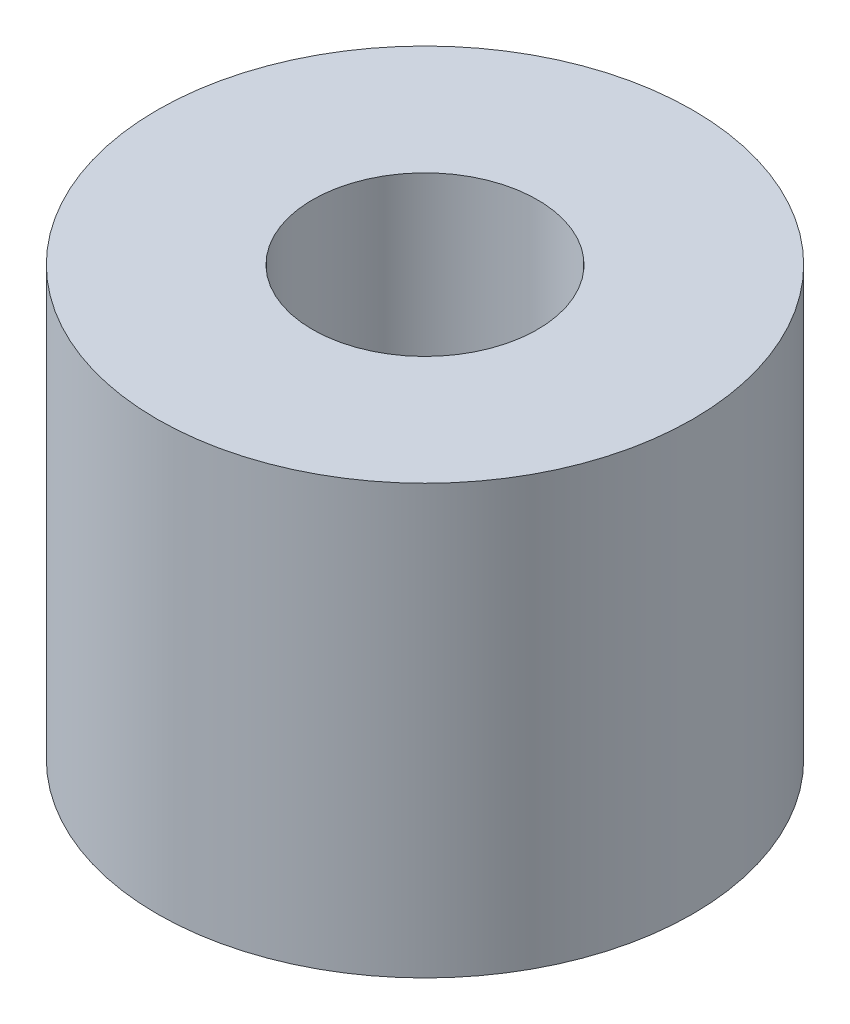
ISO-10303-21;
HEADER;
FILE_DESCRIPTION(('STEP AP214'),'2;1');
FILE_NAME('part.step','',(''),(''),'','','');
FILE_SCHEMA(('AUTOMOTIVE_DESIGN { 1 0 10303 214 1 1 1 1 }'));
ENDSEC;
DATA;
#1=APPLICATION_CONTEXT('core data for automotive mechanical design processes');
#2=APPLICATION_PROTOCOL_DEFINITION('international standard','automotive_design',2000,#1);
#3=PRODUCT_CONTEXT('',#1,'mechanical');
#4=PRODUCT('Part','Part','',(#3));
#5=PRODUCT_RELATED_PRODUCT_CATEGORY('part','',(#4));
#6=PRODUCT_DEFINITION_FORMATION('','',#4);
#7=PRODUCT_DEFINITION_CONTEXT('part definition',#1,'design');
#8=PRODUCT_DEFINITION('design','',#6,#7);
#9=PRODUCT_DEFINITION_SHAPE('','',#8);
#10=(LENGTH_UNIT() NAMED_UNIT(*) SI_UNIT(.MILLI.,.METRE.));
#11=(NAMED_UNIT(*) PLANE_ANGLE_UNIT() SI_UNIT($,.RADIAN.));
#12=(NAMED_UNIT(*) SI_UNIT($,.STERADIAN.) SOLID_ANGLE_UNIT());
#13=UNCERTAINTY_MEASURE_WITH_UNIT(LENGTH_MEASURE(1.E-05),#10,'distance_accuracy_value','');
#14=(GEOMETRIC_REPRESENTATION_CONTEXT(3) GLOBAL_UNCERTAINTY_ASSIGNED_CONTEXT((#13)) GLOBAL_UNIT_ASSIGNED_CONTEXT((#10,
#11,#12)) REPRESENTATION_CONTEXT('',''));
#15=CARTESIAN_POINT('',(0.,0.,0.));
#16=DIRECTION('',(0.,0.,1.));
#17=DIRECTION('',(1.,0.,0.));
#18=AXIS2_PLACEMENT_3D('',#15,#16,#17);
#19=CARTESIAN_POINT('',(0.,8.,0.));
#20=DIRECTION('',(0.,1.,0.));
#21=DIRECTION('',(0.,0.,1.));
#22=AXIS2_PLACEMENT_3D('',#19,#20,#21);
#23=PLANE('',#22);
#24=CARTESIAN_POINT('',(0.,8.,0.));
#25=DIRECTION('',(0.,1.,0.));
#26=DIRECTION('',(0.,0.,1.));
#27=AXIS2_PLACEMENT_3D('',#24,#25,#26);
#28=CIRCLE('',#27,5.);
#29=CARTESIAN_POINT('',(0.,8.,5.));
#30=VERTEX_POINT('',#29);
#31=EDGE_CURVE('E10',#30,#30,#28,.T.);
#32=ORIENTED_EDGE('',*,*,#31,.T.);
#33=EDGE_LOOP('',(#32));
#34=FACE_BOUND('',#33,.T.);
#35=CARTESIAN_POINT('',(0.,8.,0.));
#36=DIRECTION('',(0.,1.,0.));
#37=DIRECTION('',(0.,0.,1.));
#38=AXIS2_PLACEMENT_3D('',#35,#36,#37);
#39=CIRCLE('',#38,2.1);
#40=CARTESIAN_POINT('',(0.,8.,2.1));
#41=VERTEX_POINT('',#40);
#42=EDGE_CURVE('E50',#41,#41,#39,.T.);
#43=ORIENTED_EDGE('',*,*,#42,.F.);
#44=EDGE_LOOP('',(#43));
#45=FACE_BOUND('',#44,.T.);
#46=ADVANCED_FACE('F37',(#34,#45),#23,.T.);
#47=CARTESIAN_POINT('',(0.,0.,0.));
#48=DIRECTION('',(0.,1.,0.));
#49=DIRECTION('',(0.,0.,1.));
#50=AXIS2_PLACEMENT_3D('',#47,#48,#49);
#51=PLANE('',#50);
#52=CARTESIAN_POINT('',(0.,0.,0.));
#53=DIRECTION('',(0.,1.,0.));
#54=DIRECTION('',(0.,0.,1.));
#55=AXIS2_PLACEMENT_3D('',#52,#53,#54);
#56=CIRCLE('',#55,5.);
#57=CARTESIAN_POINT('',(0.,0.,5.));
#58=VERTEX_POINT('',#57);
#59=EDGE_CURVE('E41',#58,#58,#56,.T.);
#60=ORIENTED_EDGE('',*,*,#59,.F.);
#61=EDGE_LOOP('',(#60));
#62=FACE_BOUND('',#61,.T.);
#63=CARTESIAN_POINT('',(0.,0.,0.));
#64=DIRECTION('',(0.,1.,0.));
#65=DIRECTION('',(0.,0.,1.));
#66=AXIS2_PLACEMENT_3D('',#63,#64,#65);
#67=CIRCLE('',#66,2.1);
#68=CARTESIAN_POINT('',(0.,0.,2.1));
#69=VERTEX_POINT('',#68);
#70=EDGE_CURVE('E52',#69,#69,#67,.T.);
#71=ORIENTED_EDGE('',*,*,#70,.T.);
#72=EDGE_LOOP('',(#71));
#73=FACE_BOUND('',#72,.T.);
#74=ADVANCED_FACE('F64',(#62,#73),#51,.F.);
#75=CARTESIAN_POINT('',(0.,8.,0.));
#76=DIRECTION('',(0.,-1.,0.));
#77=DIRECTION('',(0.,0.,-1.));
#78=AXIS2_PLACEMENT_3D('',#75,#76,#77);
#79=CYLINDRICAL_SURFACE('',#78,5.);
#80=ORIENTED_EDGE('',*,*,#31,.F.);
#81=EDGE_LOOP('',(#80));
#82=FACE_BOUND('',#81,.T.);
#83=ORIENTED_EDGE('',*,*,#59,.T.);
#84=EDGE_LOOP('',(#83));
#85=FACE_BOUND('',#84,.T.);
#86=ADVANCED_FACE('F39',(#82,#85),#79,.T.);
#87=CARTESIAN_POINT('',(0.,8.,0.));
#88=DIRECTION('',(0.,-1.,0.));
#89=DIRECTION('',(0.,0.,-1.));
#90=AXIS2_PLACEMENT_3D('',#87,#88,#89);
#91=CYLINDRICAL_SURFACE('',#90,2.1);
#92=ORIENTED_EDGE('',*,*,#42,.T.);
#93=EDGE_LOOP('',(#92));
#94=FACE_BOUND('',#93,.T.);
#95=ORIENTED_EDGE('',*,*,#70,.F.);
#96=EDGE_LOOP('',(#95));
#97=FACE_BOUND('',#96,.T.);
#98=ADVANCED_FACE('F60',(#94,#97),#91,.F.);
#99=CLOSED_SHELL('',(#46,#74,#86,#98));
#100=MANIFOLD_SOLID_BREP('B2',#99);
#101=ADVANCED_BREP_SHAPE_REPRESENTATION('',(#18,#100),#14);
#102=SHAPE_DEFINITION_REPRESENTATION(#9,#101);
ENDSEC;
END-ISO-10303-21;
